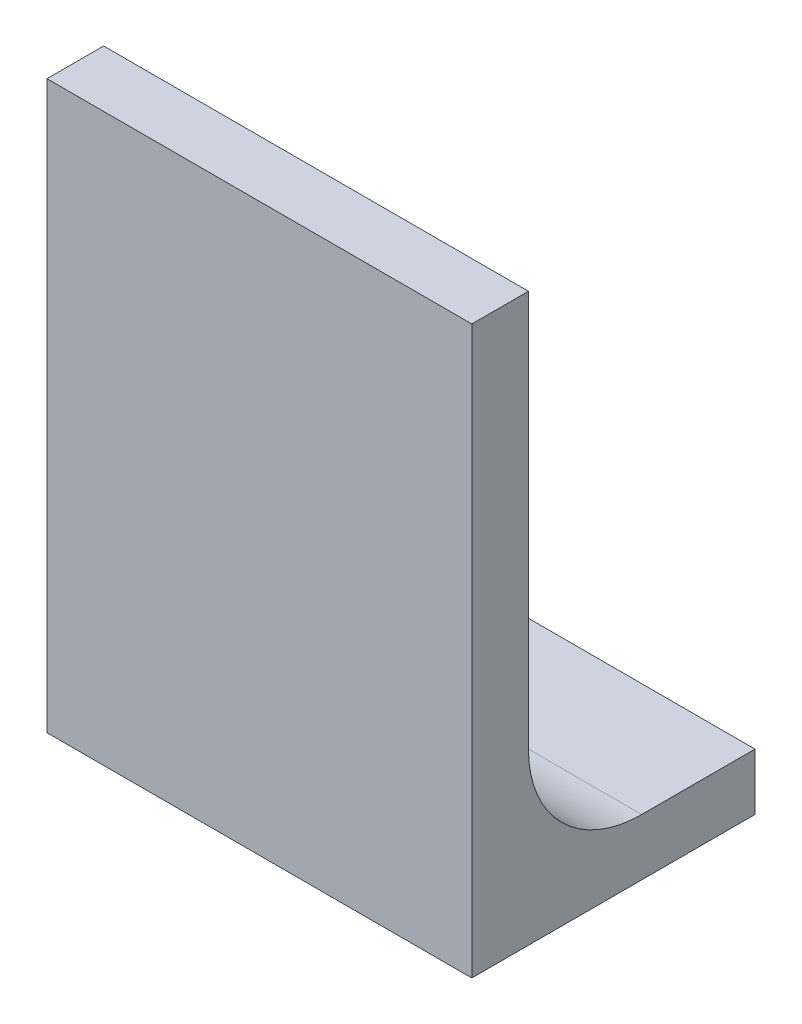
ISO-10303-21;
HEADER;
FILE_DESCRIPTION(('STEP AP214'),'2;1');
FILE_NAME('part.step','',(''),(''),'','','');
FILE_SCHEMA(('AUTOMOTIVE_DESIGN { 1 0 10303 214 1 1 1 1 }'));
ENDSEC;
DATA;
#1=APPLICATION_CONTEXT('core data for automotive mechanical design processes');
#2=APPLICATION_PROTOCOL_DEFINITION('international standard','automotive_design',2000,#1);
#3=PRODUCT_CONTEXT('',#1,'mechanical');
#4=PRODUCT('Part','Part','',(#3));
#5=PRODUCT_RELATED_PRODUCT_CATEGORY('part','',(#4));
#6=PRODUCT_DEFINITION_FORMATION('','',#4);
#7=PRODUCT_DEFINITION_CONTEXT('part definition',#1,'design');
#8=PRODUCT_DEFINITION('design','',#6,#7);
#9=PRODUCT_DEFINITION_SHAPE('','',#8);
#10=(LENGTH_UNIT() NAMED_UNIT(*) SI_UNIT(.MILLI.,.METRE.));
#11=(NAMED_UNIT(*) PLANE_ANGLE_UNIT() SI_UNIT($,.RADIAN.));
#12=(NAMED_UNIT(*) SI_UNIT($,.STERADIAN.) SOLID_ANGLE_UNIT());
#13=UNCERTAINTY_MEASURE_WITH_UNIT(LENGTH_MEASURE(1.E-05),#10,'distance_accuracy_value','');
#14=(GEOMETRIC_REPRESENTATION_CONTEXT(3) GLOBAL_UNCERTAINTY_ASSIGNED_CONTEXT((#13)) GLOBAL_UNIT_ASSIGNED_CONTEXT((#10,
#11,#12)) REPRESENTATION_CONTEXT('',''));
#15=CARTESIAN_POINT('',(0.,0.,0.));
#16=DIRECTION('',(0.,0.,1.));
#17=DIRECTION('',(1.,0.,0.));
#18=AXIS2_PLACEMENT_3D('',#15,#16,#17);
#19=CARTESIAN_POINT('',(36.5072356062987,-0.916176926646898,-2.75));
#20=DIRECTION('',(0.,1.,0.));
#21=DIRECTION('',(0.,0.,1.));
#22=AXIS2_PLACEMENT_3D('',#19,#20,#21);
#23=PLANE('',#22);
#24=DIRECTION('',(-1.,0.,0.));
#25=VECTOR('',#24,1.);
#26=CARTESIAN_POINT('',(36.5072356062987,-0.916176926646898,-1.75));
#27=LINE('',#26,#25);
#28=CARTESIAN_POINT('',(36.5072356062987,-0.916176926646898,-1.75));
#29=VERTEX_POINT('',#28);
#30=CARTESIAN_POINT('',(29.0072356062988,-0.916176926646898,-1.75));
#31=VERTEX_POINT('',#30);
#32=EDGE_CURVE('E107',#29,#31,#27,.T.);
#33=ORIENTED_EDGE('',*,*,#32,.T.);
#34=DIRECTION('',(0.,0.,1.));
#35=VECTOR('',#34,1.);
#36=CARTESIAN_POINT('',(29.0072356062988,-0.916176926646898,-2.75));
#37=LINE('',#36,#35);
#38=CARTESIAN_POINT('',(29.0072356062988,-0.916176926646898,-6.75));
#39=VERTEX_POINT('',#38);
#40=EDGE_CURVE('E100',#39,#31,#37,.T.);
#41=ORIENTED_EDGE('',*,*,#40,.F.);
#42=DIRECTION('',(-1.,0.,0.));
#43=VECTOR('',#42,1.);
#44=CARTESIAN_POINT('',(36.5072356062987,-0.916176926646898,-6.75));
#45=LINE('',#44,#43);
#46=CARTESIAN_POINT('',(36.5072356062987,-0.916176926646898,-6.75));
#47=VERTEX_POINT('',#46);
#48=EDGE_CURVE('E104',#47,#39,#45,.T.);
#49=ORIENTED_EDGE('',*,*,#48,.F.);
#50=DIRECTION('',(0.,0.,1.));
#51=VECTOR('',#50,1.);
#52=CARTESIAN_POINT('',(36.5072356062987,-0.916176926646898,-2.75));
#53=LINE('',#52,#51);
#54=EDGE_CURVE('E139',#47,#29,#53,.T.);
#55=ORIENTED_EDGE('',*,*,#54,.T.);
#56=EDGE_LOOP('',(#33,#41,#49,#55));
#57=FACE_BOUND('',#56,.T.);
#58=ADVANCED_FACE('F41',(#57),#23,.F.);
#59=CARTESIAN_POINT('',(29.0072356062988,9.0838230733531,-2.75));
#60=DIRECTION('',(-1.,0.,0.));
#61=DIRECTION('',(0.,0.,1.));
#62=AXIS2_PLACEMENT_3D('',#59,#60,#61);
#63=PLANE('',#62);
#64=DIRECTION('',(0.,-1.,0.));
#65=VECTOR('',#64,1.);
#66=CARTESIAN_POINT('',(29.0072356062988,9.0838230733531,-2.75));
#67=LINE('',#66,#65);
#68=CARTESIAN_POINT('',(29.0072356062988,9.0838230733531,-2.75));
#69=VERTEX_POINT('',#68);
#70=CARTESIAN_POINT('',(29.0072356062988,2.0838230733531,-2.75));
#71=VERTEX_POINT('',#70);
#72=EDGE_CURVE('E130',#69,#71,#67,.T.);
#73=ORIENTED_EDGE('',*,*,#72,.T.);
#74=CARTESIAN_POINT('',(29.0072356062988,2.0838230733531,-4.75));
#75=DIRECTION('',(-1.,0.,0.));
#76=DIRECTION('',(0.,0.,1.));
#77=AXIS2_PLACEMENT_3D('',#74,#75,#76);
#78=CIRCLE('',#77,2.);
#79=CARTESIAN_POINT('',(29.0072356062987,0.0838230733531025,-4.75));
#80=VERTEX_POINT('',#79);
#81=EDGE_CURVE('E49',#71,#80,#78,.F.);
#82=ORIENTED_EDGE('',*,*,#81,.T.);
#83=DIRECTION('',(0.,0.,1.));
#84=VECTOR('',#83,1.);
#85=CARTESIAN_POINT('',(29.0072356062987,0.0838230733531025,-6.75));
#86=LINE('',#85,#84);
#87=CARTESIAN_POINT('',(29.0072356062987,0.0838230733531025,-6.75));
#88=VERTEX_POINT('',#87);
#89=EDGE_CURVE('E114',#88,#80,#86,.T.);
#90=ORIENTED_EDGE('',*,*,#89,.F.);
#91=DIRECTION('',(0.,1.,0.));
#92=VECTOR('',#91,1.);
#93=CARTESIAN_POINT('',(29.0072356062988,-0.916176926646898,-6.75));
#94=LINE('',#93,#92);
#95=EDGE_CURVE('E112',#39,#88,#94,.T.);
#96=ORIENTED_EDGE('',*,*,#95,.F.);
#97=ORIENTED_EDGE('',*,*,#40,.T.);
#98=DIRECTION('',(0.,-1.,0.));
#99=VECTOR('',#98,1.);
#100=CARTESIAN_POINT('',(29.0072356062988,9.0838230733531,-1.75));
#101=LINE('',#100,#99);
#102=CARTESIAN_POINT('',(29.0072356062988,9.0838230733531,-1.75));
#103=VERTEX_POINT('',#102);
#104=EDGE_CURVE('E141',#103,#31,#101,.T.);
#105=ORIENTED_EDGE('',*,*,#104,.F.);
#106=DIRECTION('',(0.,0.,1.));
#107=VECTOR('',#106,1.);
#108=CARTESIAN_POINT('',(29.0072356062988,9.0838230733531,-2.75));
#109=LINE('',#108,#107);
#110=EDGE_CURVE('E110',#69,#103,#109,.T.);
#111=ORIENTED_EDGE('',*,*,#110,.F.);
#112=EDGE_LOOP('',(#73,#82,#90,#96,#97,#105,#111));
#113=FACE_BOUND('',#112,.T.);
#114=ADVANCED_FACE('F113',(#113),#63,.T.);
#115=CARTESIAN_POINT('',(36.5072356062988,9.0838230733531,-2.75));
#116=DIRECTION('',(0.,1.,0.));
#117=DIRECTION('',(0.,0.,1.));
#118=AXIS2_PLACEMENT_3D('',#115,#116,#117);
#119=PLANE('',#118);
#120=DIRECTION('',(-1.,0.,0.));
#121=VECTOR('',#120,1.);
#122=CARTESIAN_POINT('',(36.5072356062988,9.0838230733531,-1.75));
#123=LINE('',#122,#121);
#124=CARTESIAN_POINT('',(36.5072356062988,9.0838230733531,-1.75));
#125=VERTEX_POINT('',#124);
#126=EDGE_CURVE('E143',#125,#103,#123,.T.);
#127=ORIENTED_EDGE('',*,*,#126,.F.);
#128=DIRECTION('',(0.,0.,1.));
#129=VECTOR('',#128,1.);
#130=CARTESIAN_POINT('',(36.5072356062988,9.0838230733531,-2.75));
#131=LINE('',#130,#129);
#132=CARTESIAN_POINT('',(36.5072356062988,9.0838230733531,-2.75));
#133=VERTEX_POINT('',#132);
#134=EDGE_CURVE('E148',#133,#125,#131,.T.);
#135=ORIENTED_EDGE('',*,*,#134,.F.);
#136=DIRECTION('',(-1.,0.,0.));
#137=VECTOR('',#136,1.);
#138=CARTESIAN_POINT('',(36.5072356062988,9.0838230733531,-2.75));
#139=LINE('',#138,#137);
#140=EDGE_CURVE('E132',#133,#69,#139,.T.);
#141=ORIENTED_EDGE('',*,*,#140,.T.);
#142=ORIENTED_EDGE('',*,*,#110,.T.);
#143=EDGE_LOOP('',(#127,#135,#141,#142));
#144=FACE_BOUND('',#143,.T.);
#145=ADVANCED_FACE('F163',(#144),#119,.T.);
#146=CARTESIAN_POINT('',(36.5072356062988,9.0838230733531,-2.75));
#147=DIRECTION('',(-1.,0.,0.));
#148=DIRECTION('',(0.,-1.,0.));
#149=AXIS2_PLACEMENT_3D('',#146,#147,#148);
#150=PLANE('',#149);
#151=DIRECTION('',(0.,-1.,0.));
#152=VECTOR('',#151,1.);
#153=CARTESIAN_POINT('',(36.5072356062988,9.0838230733531,-1.75));
#154=LINE('',#153,#152);
#155=EDGE_CURVE('E133',#125,#29,#154,.T.);
#156=ORIENTED_EDGE('',*,*,#155,.T.);
#157=ORIENTED_EDGE('',*,*,#54,.F.);
#158=DIRECTION('',(0.,1.,0.));
#159=VECTOR('',#158,1.);
#160=CARTESIAN_POINT('',(36.5072356062987,-0.916176926646898,-6.75));
#161=LINE('',#160,#159);
#162=CARTESIAN_POINT('',(36.5072356062987,0.0838230733531025,-6.75));
#163=VERTEX_POINT('',#162);
#164=EDGE_CURVE('E122',#47,#163,#161,.T.);
#165=ORIENTED_EDGE('',*,*,#164,.T.);
#166=DIRECTION('',(0.,0.,1.));
#167=VECTOR('',#166,1.);
#168=CARTESIAN_POINT('',(36.5072356062987,0.0838230733531025,-6.75));
#169=LINE('',#168,#167);
#170=CARTESIAN_POINT('',(36.5072356062987,0.0838230733531025,-4.75));
#171=VERTEX_POINT('',#170);
#172=EDGE_CURVE('E127',#163,#171,#169,.T.);
#173=ORIENTED_EDGE('',*,*,#172,.T.);
#174=CARTESIAN_POINT('',(36.5072356062987,2.0838230733531,-4.75));
#175=DIRECTION('',(-1.,0.,0.));
#176=DIRECTION('',(0.,-1.,0.));
#177=AXIS2_PLACEMENT_3D('',#174,#175,#176);
#178=CIRCLE('',#177,2.);
#179=CARTESIAN_POINT('',(36.5072356062987,2.0838230733531,-2.75));
#180=VERTEX_POINT('',#179);
#181=EDGE_CURVE('E11',#171,#180,#178,.T.);
#182=ORIENTED_EDGE('',*,*,#181,.T.);
#183=DIRECTION('',(0.,-1.,0.));
#184=VECTOR('',#183,1.);
#185=CARTESIAN_POINT('',(36.5072356062988,9.0838230733531,-2.75));
#186=LINE('',#185,#184);
#187=EDGE_CURVE('E136',#133,#180,#186,.T.);
#188=ORIENTED_EDGE('',*,*,#187,.F.);
#189=ORIENTED_EDGE('',*,*,#134,.T.);
#190=EDGE_LOOP('',(#156,#157,#165,#173,#182,#188,#189));
#191=FACE_BOUND('',#190,.T.);
#192=ADVANCED_FACE('F166',(#191),#150,.F.);
#193=CARTESIAN_POINT('',(0.,0.,-2.75));
#194=DIRECTION('',(0.,0.,1.));
#195=DIRECTION('',(1.,0.,0.));
#196=AXIS2_PLACEMENT_3D('',#193,#194,#195);
#197=PLANE('',#196);
#198=ORIENTED_EDGE('',*,*,#187,.T.);
#199=DIRECTION('',(-1.,0.,0.));
#200=VECTOR('',#199,1.);
#201=CARTESIAN_POINT('',(0.,2.0838230733531,-2.75));
#202=LINE('',#201,#200);
#203=EDGE_CURVE('E109',#180,#71,#202,.T.);
#204=ORIENTED_EDGE('',*,*,#203,.T.);
#205=ORIENTED_EDGE('',*,*,#72,.F.);
#206=ORIENTED_EDGE('',*,*,#140,.F.);
#207=EDGE_LOOP('',(#198,#204,#205,#206));
#208=FACE_BOUND('',#207,.T.);
#209=ADVANCED_FACE('F156',(#208),#197,.F.);
#210=CARTESIAN_POINT('',(0.,0.,-1.75));
#211=DIRECTION('',(0.,0.,1.));
#212=DIRECTION('',(1.,0.,0.));
#213=AXIS2_PLACEMENT_3D('',#210,#211,#212);
#214=PLANE('',#213);
#215=ORIENTED_EDGE('',*,*,#104,.T.);
#216=ORIENTED_EDGE('',*,*,#32,.F.);
#217=ORIENTED_EDGE('',*,*,#155,.F.);
#218=ORIENTED_EDGE('',*,*,#126,.T.);
#219=EDGE_LOOP('',(#215,#216,#217,#218));
#220=FACE_BOUND('',#219,.T.);
#221=ADVANCED_FACE('F185',(#220),#214,.T.);
#222=CARTESIAN_POINT('',(36.5072356062987,0.0838230733531025,-6.75));
#223=DIRECTION('',(0.,1.,0.));
#224=DIRECTION('',(0.,0.,1.));
#225=AXIS2_PLACEMENT_3D('',#222,#223,#224);
#226=PLANE('',#225);
#227=ORIENTED_EDGE('',*,*,#89,.T.);
#228=DIRECTION('',(-1.,0.,0.));
#229=VECTOR('',#228,1.);
#230=CARTESIAN_POINT('',(36.5072356062987,0.0838230733531025,-4.75));
#231=LINE('',#230,#229);
#232=EDGE_CURVE('E62',#80,#171,#231,.F.);
#233=ORIENTED_EDGE('',*,*,#232,.T.);
#234=ORIENTED_EDGE('',*,*,#172,.F.);
#235=DIRECTION('',(-1.,0.,0.));
#236=VECTOR('',#235,1.);
#237=CARTESIAN_POINT('',(36.5072356062987,0.0838230733531025,-6.75));
#238=LINE('',#237,#236);
#239=EDGE_CURVE('E118',#163,#88,#238,.T.);
#240=ORIENTED_EDGE('',*,*,#239,.T.);
#241=EDGE_LOOP('',(#227,#233,#234,#240));
#242=FACE_BOUND('',#241,.T.);
#243=ADVANCED_FACE('F172',(#242),#226,.T.);
#244=CARTESIAN_POINT('',(0.,0.,-6.75));
#245=DIRECTION('',(0.,0.,-1.));
#246=DIRECTION('',(-1.,0.,0.));
#247=AXIS2_PLACEMENT_3D('',#244,#245,#246);
#248=PLANE('',#247);
#249=ORIENTED_EDGE('',*,*,#48,.T.);
#250=ORIENTED_EDGE('',*,*,#95,.T.);
#251=ORIENTED_EDGE('',*,*,#239,.F.);
#252=ORIENTED_EDGE('',*,*,#164,.F.);
#253=EDGE_LOOP('',(#249,#250,#251,#252));
#254=FACE_BOUND('',#253,.T.);
#255=ADVANCED_FACE('F120',(#254),#248,.T.);
#256=CARTESIAN_POINT('',(0.,2.0838230733531,-4.75));
#257=DIRECTION('',(-1.,0.,0.));
#258=DIRECTION('',(0.,0.,1.));
#259=AXIS2_PLACEMENT_3D('',#256,#257,#258);
#260=CYLINDRICAL_SURFACE('',#259,2.);
#261=ORIENTED_EDGE('',*,*,#181,.F.);
#262=ORIENTED_EDGE('',*,*,#232,.F.);
#263=ORIENTED_EDGE('',*,*,#81,.F.);
#264=ORIENTED_EDGE('',*,*,#203,.F.);
#265=EDGE_LOOP('',(#261,#262,#263,#264));
#266=FACE_BOUND('',#265,.T.);
#267=ADVANCED_FACE('F43',(#266),#260,.F.);
#268=CLOSED_SHELL('',(#58,#114,#145,#192,#209,#221,#243,#255,#267));
#269=MANIFOLD_SOLID_BREP('B2',#268);
#270=ADVANCED_BREP_SHAPE_REPRESENTATION('',(#18,#269),#14);
#271=SHAPE_DEFINITION_REPRESENTATION(#9,#270);
ENDSEC;
END-ISO-10303-21;
